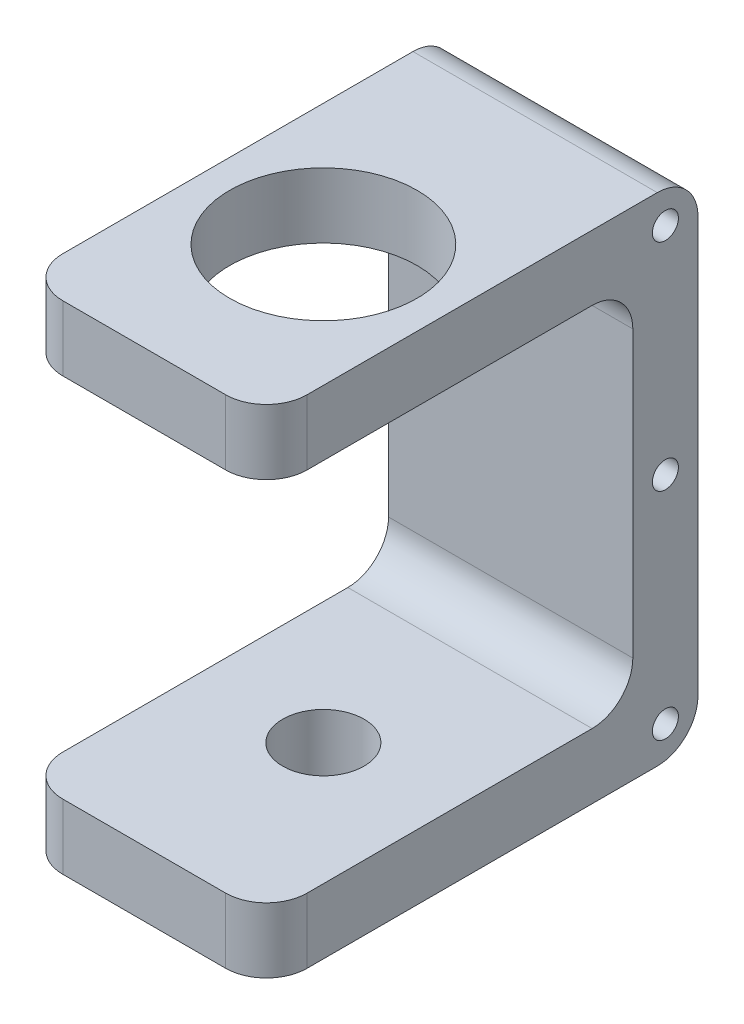
ISO-10303-21;
HEADER;
FILE_DESCRIPTION(('STEP AP214'),'2;1');
FILE_NAME('part.step','',(''),(''),'','','');
FILE_SCHEMA(('AUTOMOTIVE_DESIGN { 1 0 10303 214 1 1 1 1 }'));
ENDSEC;
DATA;
#1=APPLICATION_CONTEXT('core data for automotive mechanical design processes');
#2=APPLICATION_PROTOCOL_DEFINITION('international standard','automotive_design',2000,#1);
#3=PRODUCT_CONTEXT('',#1,'mechanical');
#4=PRODUCT('Part','Part','',(#3));
#5=PRODUCT_RELATED_PRODUCT_CATEGORY('part','',(#4));
#6=PRODUCT_DEFINITION_FORMATION('','',#4);
#7=PRODUCT_DEFINITION_CONTEXT('part definition',#1,'design');
#8=PRODUCT_DEFINITION('design','',#6,#7);
#9=PRODUCT_DEFINITION_SHAPE('','',#8);
#10=(LENGTH_UNIT() NAMED_UNIT(*) SI_UNIT(.MILLI.,.METRE.));
#11=(NAMED_UNIT(*) PLANE_ANGLE_UNIT() SI_UNIT($,.RADIAN.));
#12=(NAMED_UNIT(*) SI_UNIT($,.STERADIAN.) SOLID_ANGLE_UNIT());
#13=UNCERTAINTY_MEASURE_WITH_UNIT(LENGTH_MEASURE(1.E-05),#10,'distance_accuracy_value','');
#14=(GEOMETRIC_REPRESENTATION_CONTEXT(3) GLOBAL_UNCERTAINTY_ASSIGNED_CONTEXT((#13)) GLOBAL_UNIT_ASSIGNED_CONTEXT((#10,
#11,#12)) REPRESENTATION_CONTEXT('',''));
#15=CARTESIAN_POINT('',(0.,0.,0.));
#16=DIRECTION('',(0.,0.,1.));
#17=DIRECTION('',(1.,0.,0.));
#18=AXIS2_PLACEMENT_3D('',#15,#16,#17);
#19=CARTESIAN_POINT('',(30.,8.,0.));
#20=DIRECTION('',(0.,0.,-1.));
#21=DIRECTION('',(0.,1.,0.));
#22=AXIS2_PLACEMENT_3D('',#19,#20,#21);
#23=PLANE('',#22);
#24=DIRECTION('',(-1.,0.,0.));
#25=VECTOR('',#24,1.);
#26=CARTESIAN_POINT('',(30.,8.,0.));
#27=LINE('',#26,#25);
#28=CARTESIAN_POINT('',(25.,8.,0.));
#29=VERTEX_POINT('',#28);
#30=CARTESIAN_POINT('',(5.,8.,0.));
#31=VERTEX_POINT('',#30);
#32=EDGE_CURVE('E181',#29,#31,#27,.T.);
#33=ORIENTED_EDGE('',*,*,#32,.T.);
#34=DIRECTION('',(0.,-1.,0.));
#35=VECTOR('',#34,1.);
#36=CARTESIAN_POINT('',(5.,8.,0.));
#37=LINE('',#36,#35);
#38=CARTESIAN_POINT('',(5.,0.,0.));
#39=VERTEX_POINT('',#38);
#40=EDGE_CURVE('E233',#31,#39,#37,.T.);
#41=ORIENTED_EDGE('',*,*,#40,.T.);
#42=DIRECTION('',(-1.,0.,0.));
#43=VECTOR('',#42,1.);
#44=CARTESIAN_POINT('',(30.,0.,0.));
#45=LINE('',#44,#43);
#46=CARTESIAN_POINT('',(25.,0.,0.));
#47=VERTEX_POINT('',#46);
#48=EDGE_CURVE('E191',#47,#39,#45,.T.);
#49=ORIENTED_EDGE('',*,*,#48,.F.);
#50=DIRECTION('',(0.,-1.,0.));
#51=VECTOR('',#50,1.);
#52=CARTESIAN_POINT('',(25.,8.,0.));
#53=LINE('',#52,#51);
#54=EDGE_CURVE('E231',#47,#29,#53,.F.);
#55=ORIENTED_EDGE('',*,*,#54,.T.);
#56=EDGE_LOOP('',(#33,#41,#49,#55));
#57=FACE_BOUND('',#56,.T.);
#58=ADVANCED_FACE('F33',(#57),#23,.F.);
#59=CARTESIAN_POINT('',(30.,0.,0.));
#60=DIRECTION('',(0.,1.,0.));
#61=DIRECTION('',(0.,0.,1.));
#62=AXIS2_PLACEMENT_3D('',#59,#60,#61);
#63=PLANE('',#62);
#64=CARTESIAN_POINT('',(15.,0.,-22.));
#65=DIRECTION('',(0.,1.,0.));
#66=DIRECTION('',(0.,0.,1.));
#67=AXIS2_PLACEMENT_3D('',#64,#65,#66);
#68=CIRCLE('',#67,11.5);
#69=CARTESIAN_POINT('',(15.,0.,-10.5));
#70=VERTEX_POINT('',#69);
#71=EDGE_CURVE('E280',#70,#70,#68,.F.);
#72=ORIENTED_EDGE('',*,*,#71,.F.);
#73=EDGE_LOOP('',(#72));
#74=FACE_BOUND('',#73,.T.);
#75=DIRECTION('',(0.,0.,-1.));
#76=VECTOR('',#75,1.);
#77=CARTESIAN_POINT('',(0.,0.,0.));
#78=LINE('',#77,#76);
#79=CARTESIAN_POINT('',(0.,0.,-5.));
#80=VERTEX_POINT('',#79);
#81=CARTESIAN_POINT('',(0.,0.,-40.));
#82=VERTEX_POINT('',#81);
#83=EDGE_CURVE('E260',#80,#82,#78,.T.);
#84=ORIENTED_EDGE('',*,*,#83,.T.);
#85=DIRECTION('',(-1.,0.,0.));
#86=VECTOR('',#85,1.);
#87=CARTESIAN_POINT('',(30.,0.,-40.));
#88=LINE('',#87,#86);
#89=CARTESIAN_POINT('',(30.,0.,-40.));
#90=VERTEX_POINT('',#89);
#91=EDGE_CURVE('E245',#82,#90,#88,.F.);
#92=ORIENTED_EDGE('',*,*,#91,.T.);
#93=DIRECTION('',(0.,0.,-1.));
#94=VECTOR('',#93,1.);
#95=CARTESIAN_POINT('',(30.,0.,0.));
#96=LINE('',#95,#94);
#97=CARTESIAN_POINT('',(30.,0.,-5.));
#98=VERTEX_POINT('',#97);
#99=EDGE_CURVE('E175',#98,#90,#96,.T.);
#100=ORIENTED_EDGE('',*,*,#99,.F.);
#101=CARTESIAN_POINT('',(25.,0.,-5.));
#102=DIRECTION('',(0.,1.,0.));
#103=DIRECTION('',(0.,0.,1.));
#104=AXIS2_PLACEMENT_3D('',#101,#102,#103);
#105=CIRCLE('',#104,5.);
#106=EDGE_CURVE('E236',#98,#47,#105,.F.);
#107=ORIENTED_EDGE('',*,*,#106,.T.);
#108=ORIENTED_EDGE('',*,*,#48,.T.);
#109=CARTESIAN_POINT('',(5.,0.,-5.));
#110=DIRECTION('',(0.,1.,0.));
#111=DIRECTION('',(0.,0.,1.));
#112=AXIS2_PLACEMENT_3D('',#109,#110,#111);
#113=CIRCLE('',#112,5.);
#114=EDGE_CURVE('E238',#39,#80,#113,.F.);
#115=ORIENTED_EDGE('',*,*,#114,.T.);
#116=EDGE_LOOP('',(#84,#92,#100,#107,#108,#115));
#117=FACE_BOUND('',#116,.T.);
#118=ADVANCED_FACE('F332',(#74,#117),#63,.F.);
#119=CARTESIAN_POINT('',(30.,0.,-45.));
#120=DIRECTION('',(0.,0.,-1.));
#121=DIRECTION('',(-1.,0.,0.));
#122=AXIS2_PLACEMENT_3D('',#119,#120,#121);
#123=PLANE('',#122);
#124=DIRECTION('',(0.,-1.,0.));
#125=VECTOR('',#124,1.);
#126=CARTESIAN_POINT('',(30.,0.,-45.));
#127=LINE('',#126,#125);
#128=CARTESIAN_POINT('',(30.,-5.,-45.));
#129=VERTEX_POINT('',#128);
#130=CARTESIAN_POINT('',(30.,-40.,-45.));
#131=VERTEX_POINT('',#130);
#132=EDGE_CURVE('E269',#129,#131,#127,.T.);
#133=ORIENTED_EDGE('',*,*,#132,.F.);
#134=DIRECTION('',(-1.,0.,0.));
#135=VECTOR('',#134,1.);
#136=CARTESIAN_POINT('',(0.,-5.,-45.));
#137=LINE('',#136,#135);
#138=CARTESIAN_POINT('',(0.,-5.,-45.));
#139=VERTEX_POINT('',#138);
#140=EDGE_CURVE('E242',#129,#139,#137,.T.);
#141=ORIENTED_EDGE('',*,*,#140,.T.);
#142=DIRECTION('',(0.,-1.,0.));
#143=VECTOR('',#142,1.);
#144=CARTESIAN_POINT('',(0.,0.,-45.));
#145=LINE('',#144,#143);
#146=CARTESIAN_POINT('',(0.,-40.,-45.));
#147=VERTEX_POINT('',#146);
#148=EDGE_CURVE('E255',#139,#147,#145,.T.);
#149=ORIENTED_EDGE('',*,*,#148,.T.);
#150=DIRECTION('',(-1.,0.,0.));
#151=VECTOR('',#150,1.);
#152=CARTESIAN_POINT('',(30.,-40.,-45.));
#153=LINE('',#152,#151);
#154=EDGE_CURVE('E240',#147,#131,#153,.F.);
#155=ORIENTED_EDGE('',*,*,#154,.T.);
#156=EDGE_LOOP('',(#133,#141,#149,#155));
#157=FACE_BOUND('',#156,.T.);
#158=ADVANCED_FACE('F258',(#157),#123,.F.);
#159=CARTESIAN_POINT('',(30.,-45.,-45.));
#160=DIRECTION('',(0.,-1.,0.));
#161=DIRECTION('',(0.,0.,-1.));
#162=AXIS2_PLACEMENT_3D('',#159,#160,#161);
#163=PLANE('',#162);
#164=CARTESIAN_POINT('',(15.,-45.,-22.));
#165=DIRECTION('',(0.,1.,0.));
#166=DIRECTION('',(0.,0.,1.));
#167=AXIS2_PLACEMENT_3D('',#164,#165,#166);
#168=CIRCLE('',#167,5.);
#169=CARTESIAN_POINT('',(15.,-45.,-17.));
#170=VERTEX_POINT('',#169);
#171=EDGE_CURVE('E407',#170,#170,#168,.T.);
#172=ORIENTED_EDGE('',*,*,#171,.F.);
#173=EDGE_LOOP('',(#172));
#174=FACE_BOUND('',#173,.T.);
#175=DIRECTION('',(0.,0.,1.));
#176=VECTOR('',#175,1.);
#177=CARTESIAN_POINT('',(30.,-45.,-45.));
#178=LINE('',#177,#176);
#179=CARTESIAN_POINT('',(30.,-45.,-40.));
#180=VERTEX_POINT('',#179);
#181=CARTESIAN_POINT('',(30.,-45.,-5.00000000000002));
#182=VERTEX_POINT('',#181);
#183=EDGE_CURVE('E264',#180,#182,#178,.T.);
#184=ORIENTED_EDGE('',*,*,#183,.F.);
#185=DIRECTION('',(-1.,0.,0.));
#186=VECTOR('',#185,1.);
#187=CARTESIAN_POINT('',(0.,-45.,-40.));
#188=LINE('',#187,#186);
#189=CARTESIAN_POINT('',(0.,-45.,-40.));
#190=VERTEX_POINT('',#189);
#191=EDGE_CURVE('E247',#180,#190,#188,.T.);
#192=ORIENTED_EDGE('',*,*,#191,.T.);
#193=DIRECTION('',(0.,0.,1.));
#194=VECTOR('',#193,1.);
#195=CARTESIAN_POINT('',(0.,-45.,-45.));
#196=LINE('',#195,#194);
#197=CARTESIAN_POINT('',(0.,-45.,-5.00000000000002));
#198=VERTEX_POINT('',#197);
#199=EDGE_CURVE('E177',#190,#198,#196,.T.);
#200=ORIENTED_EDGE('',*,*,#199,.T.);
#201=CARTESIAN_POINT('',(5.,-45.,-5.00000000000001));
#202=DIRECTION('',(0.,-1.,0.));
#203=DIRECTION('',(0.,0.,-1.));
#204=AXIS2_PLACEMENT_3D('',#201,#202,#203);
#205=CIRCLE('',#204,5.);
#206=CARTESIAN_POINT('',(5.,-45.,0.));
#207=VERTEX_POINT('',#206);
#208=EDGE_CURVE('E229',#198,#207,#205,.F.);
#209=ORIENTED_EDGE('',*,*,#208,.T.);
#210=DIRECTION('',(-1.,0.,0.));
#211=VECTOR('',#210,1.);
#212=CARTESIAN_POINT('',(30.,-45.,0.));
#213=LINE('',#212,#211);
#214=CARTESIAN_POINT('',(25.,-45.,0.));
#215=VERTEX_POINT('',#214);
#216=EDGE_CURVE('E188',#215,#207,#213,.T.);
#217=ORIENTED_EDGE('',*,*,#216,.F.);
#218=CARTESIAN_POINT('',(25.,-45.,-5.00000000000001));
#219=DIRECTION('',(0.,-1.,0.));
#220=DIRECTION('',(0.,0.,-1.));
#221=AXIS2_PLACEMENT_3D('',#218,#219,#220);
#222=CIRCLE('',#221,5.);
#223=EDGE_CURVE('E226',#215,#182,#222,.F.);
#224=ORIENTED_EDGE('',*,*,#223,.T.);
#225=EDGE_LOOP('',(#184,#192,#200,#209,#217,#224));
#226=FACE_BOUND('',#225,.T.);
#227=ADVANCED_FACE('F263',(#174,#226),#163,.F.);
#228=CARTESIAN_POINT('',(30.,-45.,0.));
#229=DIRECTION('',(0.,0.,-1.));
#230=DIRECTION('',(0.,1.,0.));
#231=AXIS2_PLACEMENT_3D('',#228,#229,#230);
#232=PLANE('',#231);
#233=ORIENTED_EDGE('',*,*,#216,.T.);
#234=DIRECTION('',(0.,-1.,0.));
#235=VECTOR('',#234,1.);
#236=CARTESIAN_POINT('',(5.,-45.,0.));
#237=LINE('',#236,#235);
#238=CARTESIAN_POINT('',(5.,-53.,0.));
#239=VERTEX_POINT('',#238);
#240=EDGE_CURVE('E223',#207,#239,#237,.T.);
#241=ORIENTED_EDGE('',*,*,#240,.T.);
#242=DIRECTION('',(-1.,0.,0.));
#243=VECTOR('',#242,1.);
#244=CARTESIAN_POINT('',(30.,-53.,0.));
#245=LINE('',#244,#243);
#246=CARTESIAN_POINT('',(25.,-53.,0.));
#247=VERTEX_POINT('',#246);
#248=EDGE_CURVE('E184',#247,#239,#245,.T.);
#249=ORIENTED_EDGE('',*,*,#248,.F.);
#250=DIRECTION('',(0.,-1.,0.));
#251=VECTOR('',#250,1.);
#252=CARTESIAN_POINT('',(25.,-45.,0.));
#253=LINE('',#252,#251);
#254=EDGE_CURVE('E221',#247,#215,#253,.F.);
#255=ORIENTED_EDGE('',*,*,#254,.T.);
#256=EDGE_LOOP('',(#233,#241,#249,#255));
#257=FACE_BOUND('',#256,.T.);
#258=ADVANCED_FACE('F346',(#257),#232,.F.);
#259=CARTESIAN_POINT('',(30.,-53.,0.));
#260=DIRECTION('',(0.,1.,0.));
#261=DIRECTION('',(0.,0.,1.));
#262=AXIS2_PLACEMENT_3D('',#259,#260,#261);
#263=PLANE('',#262);
#264=CARTESIAN_POINT('',(15.,-53.,-22.));
#265=DIRECTION('',(0.,1.,0.));
#266=DIRECTION('',(0.,0.,1.));
#267=AXIS2_PLACEMENT_3D('',#264,#265,#266);
#268=CIRCLE('',#267,5.);
#269=CARTESIAN_POINT('',(15.,-53.,-17.));
#270=VERTEX_POINT('',#269);
#271=EDGE_CURVE('E290',#270,#270,#268,.F.);
#272=ORIENTED_EDGE('',*,*,#271,.F.);
#273=EDGE_LOOP('',(#272));
#274=FACE_BOUND('',#273,.T.);
#275=DIRECTION('',(0.,0.,-1.));
#276=VECTOR('',#275,1.);
#277=CARTESIAN_POINT('',(0.,-53.,0.));
#278=LINE('',#277,#276);
#279=CARTESIAN_POINT('',(0.,-53.,-5.00000000000001));
#280=VERTEX_POINT('',#279);
#281=CARTESIAN_POINT('',(0.,-53.,-48.));
#282=VERTEX_POINT('',#281);
#283=EDGE_CURVE('E172',#280,#282,#278,.T.);
#284=ORIENTED_EDGE('',*,*,#283,.T.);
#285=DIRECTION('',(-1.,0.,0.));
#286=VECTOR('',#285,1.);
#287=CARTESIAN_POINT('',(30.,-53.,-48.));
#288=LINE('',#287,#286);
#289=CARTESIAN_POINT('',(30.,-53.,-48.));
#290=VERTEX_POINT('',#289);
#291=EDGE_CURVE('E150',#282,#290,#288,.F.);
#292=ORIENTED_EDGE('',*,*,#291,.T.);
#293=DIRECTION('',(0.,0.,-1.));
#294=VECTOR('',#293,1.);
#295=CARTESIAN_POINT('',(30.,-53.,0.));
#296=LINE('',#295,#294);
#297=CARTESIAN_POINT('',(30.,-53.,-5.00000000000001));
#298=VERTEX_POINT('',#297);
#299=EDGE_CURVE('E268',#298,#290,#296,.T.);
#300=ORIENTED_EDGE('',*,*,#299,.F.);
#301=CARTESIAN_POINT('',(25.,-53.,-5.00000000000001));
#302=DIRECTION('',(0.,1.,0.));
#303=DIRECTION('',(0.,0.,1.));
#304=AXIS2_PLACEMENT_3D('',#301,#302,#303);
#305=CIRCLE('',#304,5.);
#306=EDGE_CURVE('E155',#298,#247,#305,.F.);
#307=ORIENTED_EDGE('',*,*,#306,.T.);
#308=ORIENTED_EDGE('',*,*,#248,.T.);
#309=CARTESIAN_POINT('',(5.,-53.,-5.00000000000001));
#310=DIRECTION('',(0.,1.,0.));
#311=DIRECTION('',(0.,0.,1.));
#312=AXIS2_PLACEMENT_3D('',#309,#310,#311);
#313=CIRCLE('',#312,5.);
#314=EDGE_CURVE('E201',#239,#280,#313,.F.);
#315=ORIENTED_EDGE('',*,*,#314,.T.);
#316=EDGE_LOOP('',(#284,#292,#300,#307,#308,#315));
#317=FACE_BOUND('',#316,.T.);
#318=ADVANCED_FACE('F349',(#274,#317),#263,.F.);
#319=CARTESIAN_POINT('',(30.,-53.,-53.));
#320=DIRECTION('',(0.,0.,1.));
#321=DIRECTION('',(1.,0.,0.));
#322=AXIS2_PLACEMENT_3D('',#319,#320,#321);
#323=PLANE('',#322);
#324=DIRECTION('',(0.,1.,0.));
#325=VECTOR('',#324,1.);
#326=CARTESIAN_POINT('',(30.,-53.,-53.));
#327=LINE('',#326,#325);
#328=CARTESIAN_POINT('',(30.,-48.,-53.));
#329=VERTEX_POINT('',#328);
#330=CARTESIAN_POINT('',(30.,2.99999999999999,-53.));
#331=VERTEX_POINT('',#330);
#332=EDGE_CURVE('E165',#329,#331,#327,.T.);
#333=ORIENTED_EDGE('',*,*,#332,.F.);
#334=DIRECTION('',(-1.,0.,0.));
#335=VECTOR('',#334,1.);
#336=CARTESIAN_POINT('',(30.,-48.,-53.));
#337=LINE('',#336,#335);
#338=CARTESIAN_POINT('',(0.,-48.,-53.));
#339=VERTEX_POINT('',#338);
#340=EDGE_CURVE('E149',#329,#339,#337,.T.);
#341=ORIENTED_EDGE('',*,*,#340,.T.);
#342=DIRECTION('',(0.,1.,0.));
#343=VECTOR('',#342,1.);
#344=CARTESIAN_POINT('',(0.,-53.,-53.));
#345=LINE('',#344,#343);
#346=CARTESIAN_POINT('',(0.,2.99999999999999,-53.));
#347=VERTEX_POINT('',#346);
#348=EDGE_CURVE('E162',#339,#347,#345,.T.);
#349=ORIENTED_EDGE('',*,*,#348,.T.);
#350=DIRECTION('',(-1.,0.,0.));
#351=VECTOR('',#350,1.);
#352=CARTESIAN_POINT('',(30.,3.,-53.));
#353=LINE('',#352,#351);
#354=EDGE_CURVE('E167',#347,#331,#353,.F.);
#355=ORIENTED_EDGE('',*,*,#354,.T.);
#356=EDGE_LOOP('',(#333,#341,#349,#355));
#357=FACE_BOUND('',#356,.T.);
#358=ADVANCED_FACE('F161',(#357),#323,.F.);
#359=CARTESIAN_POINT('',(30.,8.00000000000001,-53.));
#360=DIRECTION('',(0.,-1.,0.));
#361=DIRECTION('',(0.,0.,-1.));
#362=AXIS2_PLACEMENT_3D('',#359,#360,#361);
#363=PLANE('',#362);
#364=CARTESIAN_POINT('',(15.,8.,-22.));
#365=DIRECTION('',(0.,1.,0.));
#366=DIRECTION('',(0.,0.,1.));
#367=AXIS2_PLACEMENT_3D('',#364,#365,#366);
#368=CIRCLE('',#367,11.5);
#369=CARTESIAN_POINT('',(15.,8.,-10.5));
#370=VERTEX_POINT('',#369);
#371=EDGE_CURVE('E285',#370,#370,#368,.T.);
#372=ORIENTED_EDGE('',*,*,#371,.F.);
#373=EDGE_LOOP('',(#372));
#374=FACE_BOUND('',#373,.T.);
#375=DIRECTION('',(0.,0.,1.));
#376=VECTOR('',#375,1.);
#377=CARTESIAN_POINT('',(30.,8.00000000000001,-53.));
#378=LINE('',#377,#376);
#379=CARTESIAN_POINT('',(30.,8.00000000000001,-48.));
#380=VERTEX_POINT('',#379);
#381=CARTESIAN_POINT('',(30.,8.,-5.));
#382=VERTEX_POINT('',#381);
#383=EDGE_CURVE('E185',#380,#382,#378,.T.);
#384=ORIENTED_EDGE('',*,*,#383,.F.);
#385=DIRECTION('',(-1.,0.,0.));
#386=VECTOR('',#385,1.);
#387=CARTESIAN_POINT('',(30.,8.00000000000001,-48.));
#388=LINE('',#387,#386);
#389=CARTESIAN_POINT('',(0.,8.00000000000001,-48.));
#390=VERTEX_POINT('',#389);
#391=EDGE_CURVE('E218',#380,#390,#388,.T.);
#392=ORIENTED_EDGE('',*,*,#391,.T.);
#393=DIRECTION('',(0.,0.,1.));
#394=VECTOR('',#393,1.);
#395=CARTESIAN_POINT('',(0.,8.00000000000001,-53.));
#396=LINE('',#395,#394);
#397=CARTESIAN_POINT('',(0.,8.,-5.));
#398=VERTEX_POINT('',#397);
#399=EDGE_CURVE('E171',#390,#398,#396,.T.);
#400=ORIENTED_EDGE('',*,*,#399,.T.);
#401=CARTESIAN_POINT('',(5.,8.,-5.));
#402=DIRECTION('',(0.,-1.,0.));
#403=DIRECTION('',(0.,0.,-1.));
#404=AXIS2_PLACEMENT_3D('',#401,#402,#403);
#405=CIRCLE('',#404,5.);
#406=EDGE_CURVE('E216',#398,#31,#405,.F.);
#407=ORIENTED_EDGE('',*,*,#406,.T.);
#408=ORIENTED_EDGE('',*,*,#32,.F.);
#409=CARTESIAN_POINT('',(25.,8.,-5.));
#410=DIRECTION('',(0.,-1.,0.));
#411=DIRECTION('',(0.,0.,-1.));
#412=AXIS2_PLACEMENT_3D('',#409,#410,#411);
#413=CIRCLE('',#412,5.);
#414=EDGE_CURVE('E214',#29,#382,#413,.F.);
#415=ORIENTED_EDGE('',*,*,#414,.T.);
#416=EDGE_LOOP('',(#384,#392,#400,#407,#408,#415));
#417=FACE_BOUND('',#416,.T.);
#418=ADVANCED_FACE('F309',(#374,#417),#363,.F.);
#419=CARTESIAN_POINT('',(30.,0.,0.));
#420=DIRECTION('',(1.,0.,0.));
#421=DIRECTION('',(0.,0.,-1.));
#422=AXIS2_PLACEMENT_3D('',#419,#420,#421);
#423=PLANE('',#422);
#424=CARTESIAN_POINT('',(30.,4.,-49.));
#425=DIRECTION('',(1.,0.,0.));
#426=DIRECTION('',(0.,0.,-1.));
#427=AXIS2_PLACEMENT_3D('',#424,#425,#426);
#428=CIRCLE('',#427,1.6);
#429=CARTESIAN_POINT('',(30.,4.,-50.6));
#430=VERTEX_POINT('',#429);
#431=EDGE_CURVE('E393',#430,#430,#428,.T.);
#432=ORIENTED_EDGE('',*,*,#431,.F.);
#433=EDGE_LOOP('',(#432));
#434=FACE_BOUND('',#433,.T.);
#435=CARTESIAN_POINT('',(30.,-49.,-49.));
#436=DIRECTION('',(1.,0.,0.));
#437=DIRECTION('',(0.,0.,-1.));
#438=AXIS2_PLACEMENT_3D('',#435,#436,#437);
#439=CIRCLE('',#438,1.6);
#440=CARTESIAN_POINT('',(30.,-49.,-50.6));
#441=VERTEX_POINT('',#440);
#442=EDGE_CURVE('E388',#441,#441,#439,.T.);
#443=ORIENTED_EDGE('',*,*,#442,.F.);
#444=EDGE_LOOP('',(#443));
#445=FACE_BOUND('',#444,.T.);
#446=CARTESIAN_POINT('',(30.,-22.5,-49.));
#447=DIRECTION('',(1.,0.,0.));
#448=DIRECTION('',(0.,0.,-1.));
#449=AXIS2_PLACEMENT_3D('',#446,#447,#448);
#450=CIRCLE('',#449,1.6);
#451=CARTESIAN_POINT('',(30.,-22.5,-50.6));
#452=VERTEX_POINT('',#451);
#453=EDGE_CURVE('E395',#452,#452,#450,.T.);
#454=ORIENTED_EDGE('',*,*,#453,.F.);
#455=EDGE_LOOP('',(#454));
#456=FACE_BOUND('',#455,.T.);
#457=ORIENTED_EDGE('',*,*,#299,.T.);
#458=CARTESIAN_POINT('',(30.,-48.,-48.));
#459=DIRECTION('',(1.,0.,0.));
#460=DIRECTION('',(0.,0.,-1.));
#461=AXIS2_PLACEMENT_3D('',#458,#459,#460);
#462=CIRCLE('',#461,5.);
#463=EDGE_CURVE('E212',#290,#329,#462,.T.);
#464=ORIENTED_EDGE('',*,*,#463,.T.);
#465=ORIENTED_EDGE('',*,*,#332,.T.);
#466=CARTESIAN_POINT('',(30.,3.00000000000001,-48.));
#467=DIRECTION('',(1.,0.,0.));
#468=DIRECTION('',(0.,0.,-1.));
#469=AXIS2_PLACEMENT_3D('',#466,#467,#468);
#470=CIRCLE('',#469,5.);
#471=EDGE_CURVE('E210',#331,#380,#470,.T.);
#472=ORIENTED_EDGE('',*,*,#471,.T.);
#473=ORIENTED_EDGE('',*,*,#383,.T.);
#474=DIRECTION('',(0.,-1.,0.));
#475=VECTOR('',#474,1.);
#476=CARTESIAN_POINT('',(30.,0.,-5.));
#477=LINE('',#476,#475);
#478=EDGE_CURVE('E204',#382,#98,#477,.T.);
#479=ORIENTED_EDGE('',*,*,#478,.T.);
#480=ORIENTED_EDGE('',*,*,#99,.T.);
#481=CARTESIAN_POINT('',(30.,-5.,-40.));
#482=DIRECTION('',(1.,0.,0.));
#483=DIRECTION('',(0.,0.,-1.));
#484=AXIS2_PLACEMENT_3D('',#481,#482,#483);
#485=CIRCLE('',#484,5.);
#486=EDGE_CURVE('E251',#90,#129,#485,.F.);
#487=ORIENTED_EDGE('',*,*,#486,.T.);
#488=ORIENTED_EDGE('',*,*,#132,.T.);
#489=CARTESIAN_POINT('',(30.,-40.,-40.));
#490=DIRECTION('',(1.,0.,0.));
#491=DIRECTION('',(0.,0.,-1.));
#492=AXIS2_PLACEMENT_3D('',#489,#490,#491);
#493=CIRCLE('',#492,5.);
#494=EDGE_CURVE('E11',#131,#180,#493,.F.);
#495=ORIENTED_EDGE('',*,*,#494,.T.);
#496=ORIENTED_EDGE('',*,*,#183,.T.);
#497=DIRECTION('',(0.,-1.,0.));
#498=VECTOR('',#497,1.);
#499=CARTESIAN_POINT('',(30.,-53.,-5.00000000000001));
#500=LINE('',#499,#498);
#501=EDGE_CURVE('E207',#182,#298,#500,.T.);
#502=ORIENTED_EDGE('',*,*,#501,.T.);
#503=EDGE_LOOP('',(#457,#464,#465,#472,#473,#479,#480,#487,#488,#495,#496,#502));
#504=FACE_BOUND('',#503,.T.);
#505=ADVANCED_FACE('F297',(#434,#445,#456,#504),#423,.T.);
#506=CARTESIAN_POINT('',(0.,0.,0.));
#507=DIRECTION('',(1.,0.,0.));
#508=DIRECTION('',(0.,0.,-1.));
#509=AXIS2_PLACEMENT_3D('',#506,#507,#508);
#510=PLANE('',#509);
#511=CARTESIAN_POINT('',(0.,4.,-49.));
#512=DIRECTION('',(1.,0.,0.));
#513=DIRECTION('',(0.,0.,-1.));
#514=AXIS2_PLACEMENT_3D('',#511,#512,#513);
#515=CIRCLE('',#514,1.6);
#516=CARTESIAN_POINT('',(0.,4.,-50.6));
#517=VERTEX_POINT('',#516);
#518=EDGE_CURVE('E398',#517,#517,#515,.F.);
#519=ORIENTED_EDGE('',*,*,#518,.F.);
#520=EDGE_LOOP('',(#519));
#521=FACE_BOUND('',#520,.T.);
#522=CARTESIAN_POINT('',(0.,-49.,-49.));
#523=DIRECTION('',(1.,0.,0.));
#524=DIRECTION('',(0.,0.,-1.));
#525=AXIS2_PLACEMENT_3D('',#522,#523,#524);
#526=CIRCLE('',#525,1.6);
#527=CARTESIAN_POINT('',(0.,-49.,-50.6));
#528=VERTEX_POINT('',#527);
#529=EDGE_CURVE('E391',#528,#528,#526,.F.);
#530=ORIENTED_EDGE('',*,*,#529,.F.);
#531=EDGE_LOOP('',(#530));
#532=FACE_BOUND('',#531,.T.);
#533=CARTESIAN_POINT('',(0.,-22.5,-49.));
#534=DIRECTION('',(1.,0.,0.));
#535=DIRECTION('',(0.,0.,-1.));
#536=AXIS2_PLACEMENT_3D('',#533,#534,#535);
#537=CIRCLE('',#536,1.6);
#538=CARTESIAN_POINT('',(0.,-22.5,-50.6));
#539=VERTEX_POINT('',#538);
#540=EDGE_CURVE('E405',#539,#539,#537,.F.);
#541=ORIENTED_EDGE('',*,*,#540,.F.);
#542=EDGE_LOOP('',(#541));
#543=FACE_BOUND('',#542,.T.);
#544=ORIENTED_EDGE('',*,*,#348,.F.);
#545=CARTESIAN_POINT('',(0.,-48.,-48.));
#546=DIRECTION('',(1.,0.,0.));
#547=DIRECTION('',(0.,0.,-1.));
#548=AXIS2_PLACEMENT_3D('',#545,#546,#547);
#549=CIRCLE('',#548,5.);
#550=EDGE_CURVE('E145',#339,#282,#549,.F.);
#551=ORIENTED_EDGE('',*,*,#550,.T.);
#552=ORIENTED_EDGE('',*,*,#283,.F.);
#553=DIRECTION('',(0.,-1.,0.));
#554=VECTOR('',#553,1.);
#555=CARTESIAN_POINT('',(0.,0.,-5.00000000000005));
#556=LINE('',#555,#554);
#557=EDGE_CURVE('E196',#280,#198,#556,.F.);
#558=ORIENTED_EDGE('',*,*,#557,.T.);
#559=ORIENTED_EDGE('',*,*,#199,.F.);
#560=CARTESIAN_POINT('',(0.,-40.,-40.));
#561=DIRECTION('',(1.,0.,0.));
#562=DIRECTION('',(0.,0.,-1.));
#563=AXIS2_PLACEMENT_3D('',#560,#561,#562);
#564=CIRCLE('',#563,5.);
#565=EDGE_CURVE('E41',#190,#147,#564,.T.);
#566=ORIENTED_EDGE('',*,*,#565,.T.);
#567=ORIENTED_EDGE('',*,*,#148,.F.);
#568=CARTESIAN_POINT('',(0.,-5.,-40.));
#569=DIRECTION('',(1.,0.,0.));
#570=DIRECTION('',(0.,0.,-1.));
#571=AXIS2_PLACEMENT_3D('',#568,#569,#570);
#572=CIRCLE('',#571,5.);
#573=EDGE_CURVE('E249',#139,#82,#572,.T.);
#574=ORIENTED_EDGE('',*,*,#573,.T.);
#575=ORIENTED_EDGE('',*,*,#83,.F.);
#576=DIRECTION('',(0.,-1.,0.));
#577=VECTOR('',#576,1.);
#578=CARTESIAN_POINT('',(0.,0.,-5.));
#579=LINE('',#578,#577);
#580=EDGE_CURVE('E166',#80,#398,#579,.F.);
#581=ORIENTED_EDGE('',*,*,#580,.T.);
#582=ORIENTED_EDGE('',*,*,#399,.F.);
#583=CARTESIAN_POINT('',(0.,3.00000000000001,-48.));
#584=DIRECTION('',(1.,0.,0.));
#585=DIRECTION('',(0.,0.,-1.));
#586=AXIS2_PLACEMENT_3D('',#583,#584,#585);
#587=CIRCLE('',#586,5.);
#588=EDGE_CURVE('E156',#390,#347,#587,.F.);
#589=ORIENTED_EDGE('',*,*,#588,.T.);
#590=EDGE_LOOP('',(#544,#551,#552,#558,#559,#566,#567,#574,#575,#581,#582,#589));
#591=FACE_BOUND('',#590,.T.);
#592=ADVANCED_FACE('F169',(#521,#532,#543,#591),#510,.F.);
#593=CARTESIAN_POINT('',(15.,-53.001,-22.));
#594=DIRECTION('',(0.,1.,0.));
#595=DIRECTION('',(0.,0.,1.));
#596=AXIS2_PLACEMENT_3D('',#593,#594,#595);
#597=CYLINDRICAL_SURFACE('',#596,11.5);
#598=ORIENTED_EDGE('',*,*,#371,.T.);
#599=EDGE_LOOP('',(#598));
#600=FACE_BOUND('',#599,.T.);
#601=ORIENTED_EDGE('',*,*,#71,.T.);
#602=EDGE_LOOP('',(#601));
#603=FACE_BOUND('',#602,.T.);
#604=ADVANCED_FACE('F361',(#600,#603),#597,.F.);
#605=CARTESIAN_POINT('',(15.,-53.001,-22.));
#606=DIRECTION('',(0.,1.,0.));
#607=DIRECTION('',(0.,0.,1.));
#608=AXIS2_PLACEMENT_3D('',#605,#606,#607);
#609=CYLINDRICAL_SURFACE('',#608,5.);
#610=ORIENTED_EDGE('',*,*,#171,.T.);
#611=EDGE_LOOP('',(#610));
#612=FACE_BOUND('',#611,.T.);
#613=ORIENTED_EDGE('',*,*,#271,.T.);
#614=EDGE_LOOP('',(#613));
#615=FACE_BOUND('',#614,.T.);
#616=ADVANCED_FACE('F368',(#612,#615),#609,.F.);
#617=CARTESIAN_POINT('',(-0.001000000000001,-22.5,-49.));
#618=DIRECTION('',(1.,0.,0.));
#619=DIRECTION('',(0.,0.,-1.));
#620=AXIS2_PLACEMENT_3D('',#617,#618,#619);
#621=CYLINDRICAL_SURFACE('',#620,1.6);
#622=ORIENTED_EDGE('',*,*,#453,.T.);
#623=EDGE_LOOP('',(#622));
#624=FACE_BOUND('',#623,.T.);
#625=ORIENTED_EDGE('',*,*,#540,.T.);
#626=EDGE_LOOP('',(#625));
#627=FACE_BOUND('',#626,.T.);
#628=ADVANCED_FACE('F372',(#624,#627),#621,.F.);
#629=CARTESIAN_POINT('',(-0.001000000000001,-49.,-49.));
#630=DIRECTION('',(1.,0.,0.));
#631=DIRECTION('',(0.,0.,-1.));
#632=AXIS2_PLACEMENT_3D('',#629,#630,#631);
#633=CYLINDRICAL_SURFACE('',#632,1.6);
#634=ORIENTED_EDGE('',*,*,#442,.T.);
#635=EDGE_LOOP('',(#634));
#636=FACE_BOUND('',#635,.T.);
#637=ORIENTED_EDGE('',*,*,#529,.T.);
#638=EDGE_LOOP('',(#637));
#639=FACE_BOUND('',#638,.T.);
#640=ADVANCED_FACE('F376',(#636,#639),#633,.F.);
#641=CARTESIAN_POINT('',(-0.001000000000001,4.,-49.));
#642=DIRECTION('',(1.,0.,0.));
#643=DIRECTION('',(0.,0.,-1.));
#644=AXIS2_PLACEMENT_3D('',#641,#642,#643);
#645=CYLINDRICAL_SURFACE('',#644,1.6);
#646=ORIENTED_EDGE('',*,*,#431,.T.);
#647=EDGE_LOOP('',(#646));
#648=FACE_BOUND('',#647,.T.);
#649=ORIENTED_EDGE('',*,*,#518,.T.);
#650=EDGE_LOOP('',(#649));
#651=FACE_BOUND('',#650,.T.);
#652=ADVANCED_FACE('F329',(#648,#651),#645,.F.);
#653=CARTESIAN_POINT('',(30.,-48.,-48.));
#654=DIRECTION('',(-1.,0.,0.));
#655=DIRECTION('',(0.,0.,1.));
#656=AXIS2_PLACEMENT_3D('',#653,#654,#655);
#657=CYLINDRICAL_SURFACE('',#656,5.);
#658=ORIENTED_EDGE('',*,*,#463,.F.);
#659=ORIENTED_EDGE('',*,*,#291,.F.);
#660=ORIENTED_EDGE('',*,*,#550,.F.);
#661=ORIENTED_EDGE('',*,*,#340,.F.);
#662=EDGE_LOOP('',(#658,#659,#660,#661));
#663=FACE_BOUND('',#662,.T.);
#664=ADVANCED_FACE('F148',(#663),#657,.T.);
#665=CARTESIAN_POINT('',(30.,3.00000000000001,-48.));
#666=DIRECTION('',(-1.,0.,0.));
#667=DIRECTION('',(0.,0.,1.));
#668=AXIS2_PLACEMENT_3D('',#665,#666,#667);
#669=CYLINDRICAL_SURFACE('',#668,5.);
#670=ORIENTED_EDGE('',*,*,#471,.F.);
#671=ORIENTED_EDGE('',*,*,#354,.F.);
#672=ORIENTED_EDGE('',*,*,#588,.F.);
#673=ORIENTED_EDGE('',*,*,#391,.F.);
#674=EDGE_LOOP('',(#670,#671,#672,#673));
#675=FACE_BOUND('',#674,.T.);
#676=ADVANCED_FACE('F319',(#675),#669,.T.);
#677=CARTESIAN_POINT('',(5.,-45.,-5.00000000000001));
#678=DIRECTION('',(0.,-1.,0.));
#679=DIRECTION('',(0.,0.,-1.));
#680=AXIS2_PLACEMENT_3D('',#677,#678,#679);
#681=CYLINDRICAL_SURFACE('',#680,5.);
#682=ORIENTED_EDGE('',*,*,#208,.F.);
#683=ORIENTED_EDGE('',*,*,#557,.F.);
#684=ORIENTED_EDGE('',*,*,#314,.F.);
#685=ORIENTED_EDGE('',*,*,#240,.F.);
#686=EDGE_LOOP('',(#682,#683,#684,#685));
#687=FACE_BOUND('',#686,.T.);
#688=ADVANCED_FACE('F321',(#687),#681,.T.);
#689=CARTESIAN_POINT('',(5.,8.,-5.));
#690=DIRECTION('',(0.,-1.,0.));
#691=DIRECTION('',(0.,0.,-1.));
#692=AXIS2_PLACEMENT_3D('',#689,#690,#691);
#693=CYLINDRICAL_SURFACE('',#692,5.);
#694=ORIENTED_EDGE('',*,*,#406,.F.);
#695=ORIENTED_EDGE('',*,*,#580,.F.);
#696=ORIENTED_EDGE('',*,*,#114,.F.);
#697=ORIENTED_EDGE('',*,*,#40,.F.);
#698=EDGE_LOOP('',(#694,#695,#696,#697));
#699=FACE_BOUND('',#698,.T.);
#700=ADVANCED_FACE('F304',(#699),#693,.T.);
#701=CARTESIAN_POINT('',(25.,0.,-5.00000000000005));
#702=DIRECTION('',(0.,1.,0.));
#703=DIRECTION('',(0.,0.,1.));
#704=AXIS2_PLACEMENT_3D('',#701,#702,#703);
#705=CYLINDRICAL_SURFACE('',#704,5.);
#706=ORIENTED_EDGE('',*,*,#223,.F.);
#707=ORIENTED_EDGE('',*,*,#254,.F.);
#708=ORIENTED_EDGE('',*,*,#306,.F.);
#709=ORIENTED_EDGE('',*,*,#501,.F.);
#710=EDGE_LOOP('',(#706,#707,#708,#709));
#711=FACE_BOUND('',#710,.T.);
#712=ADVANCED_FACE('F421',(#711),#705,.T.);
#713=CARTESIAN_POINT('',(25.,0.,-5.));
#714=DIRECTION('',(0.,1.,0.));
#715=DIRECTION('',(0.,0.,1.));
#716=AXIS2_PLACEMENT_3D('',#713,#714,#715);
#717=CYLINDRICAL_SURFACE('',#716,5.);
#718=ORIENTED_EDGE('',*,*,#414,.F.);
#719=ORIENTED_EDGE('',*,*,#54,.F.);
#720=ORIENTED_EDGE('',*,*,#106,.F.);
#721=ORIENTED_EDGE('',*,*,#478,.F.);
#722=EDGE_LOOP('',(#718,#719,#720,#721));
#723=FACE_BOUND('',#722,.T.);
#724=ADVANCED_FACE('F315',(#723),#717,.T.);
#725=CARTESIAN_POINT('',(30.,-5.,-40.));
#726=DIRECTION('',(1.,0.,0.));
#727=DIRECTION('',(0.,0.,-1.));
#728=AXIS2_PLACEMENT_3D('',#725,#726,#727);
#729=CYLINDRICAL_SURFACE('',#728,5.);
#730=ORIENTED_EDGE('',*,*,#486,.F.);
#731=ORIENTED_EDGE('',*,*,#91,.F.);
#732=ORIENTED_EDGE('',*,*,#573,.F.);
#733=ORIENTED_EDGE('',*,*,#140,.F.);
#734=EDGE_LOOP('',(#730,#731,#732,#733));
#735=FACE_BOUND('',#734,.T.);
#736=ADVANCED_FACE('F300',(#735),#729,.F.);
#737=CARTESIAN_POINT('',(30.,-40.,-40.));
#738=DIRECTION('',(1.,0.,0.));
#739=DIRECTION('',(0.,0.,-1.));
#740=AXIS2_PLACEMENT_3D('',#737,#738,#739);
#741=CYLINDRICAL_SURFACE('',#740,5.);
#742=ORIENTED_EDGE('',*,*,#494,.F.);
#743=ORIENTED_EDGE('',*,*,#154,.F.);
#744=ORIENTED_EDGE('',*,*,#565,.F.);
#745=ORIENTED_EDGE('',*,*,#191,.F.);
#746=EDGE_LOOP('',(#742,#743,#744,#745));
#747=FACE_BOUND('',#746,.T.);
#748=ADVANCED_FACE('F35',(#747),#741,.F.);
#749=CLOSED_SHELL('',(#58,#118,#158,#227,#258,#318,#358,#418,#505,#592,#604,#616,#628,#640,#652,
#664,#676,#688,#700,#712,#724,#736,#748));
#750=MANIFOLD_SOLID_BREP('B2',#749);
#751=ADVANCED_BREP_SHAPE_REPRESENTATION('',(#18,#750),#14);
#752=SHAPE_DEFINITION_REPRESENTATION(#9,#751);
ENDSEC;
END-ISO-10303-21;
